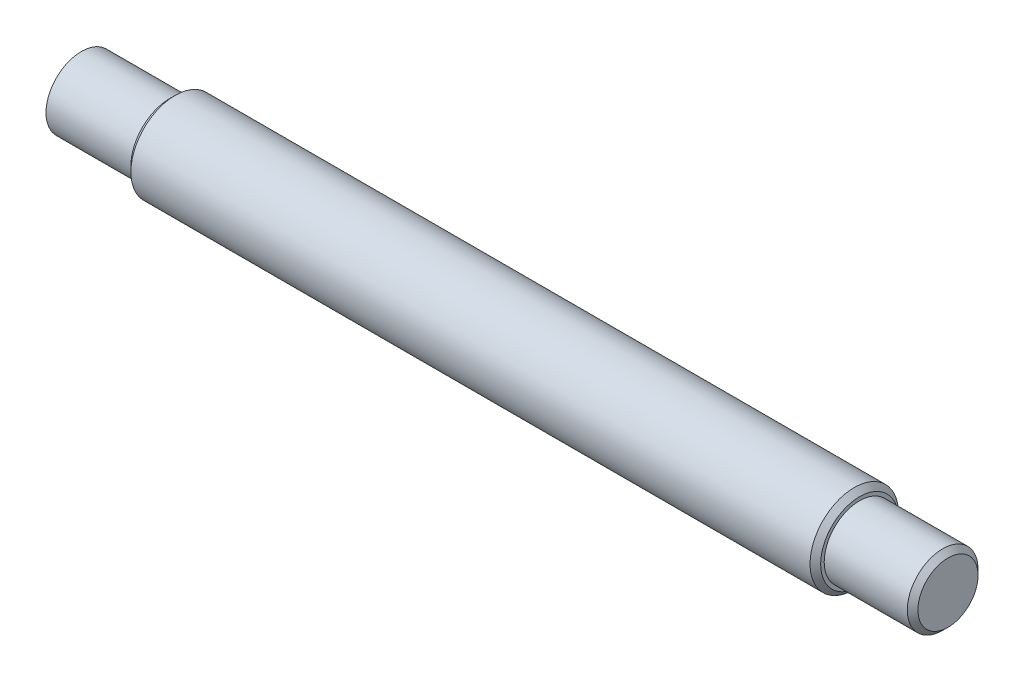
ISO-10303-21;
HEADER;
FILE_DESCRIPTION(('STEP AP214'),'2;1');
FILE_NAME('part.step','',(''),(''),'','','');
FILE_SCHEMA(('AUTOMOTIVE_DESIGN { 1 0 10303 214 1 1 1 1 }'));
ENDSEC;
DATA;
#1=APPLICATION_CONTEXT('core data for automotive mechanical design processes');
#2=APPLICATION_PROTOCOL_DEFINITION('international standard','automotive_design',2000,#1);
#3=PRODUCT_CONTEXT('',#1,'mechanical');
#4=PRODUCT('Part','Part','',(#3));
#5=PRODUCT_RELATED_PRODUCT_CATEGORY('part','',(#4));
#6=PRODUCT_DEFINITION_FORMATION('','',#4);
#7=PRODUCT_DEFINITION_CONTEXT('part definition',#1,'design');
#8=PRODUCT_DEFINITION('design','',#6,#7);
#9=PRODUCT_DEFINITION_SHAPE('','',#8);
#10=(LENGTH_UNIT() NAMED_UNIT(*) SI_UNIT(.MILLI.,.METRE.));
#11=(NAMED_UNIT(*) PLANE_ANGLE_UNIT() SI_UNIT($,.RADIAN.));
#12=(NAMED_UNIT(*) SI_UNIT($,.STERADIAN.) SOLID_ANGLE_UNIT());
#13=UNCERTAINTY_MEASURE_WITH_UNIT(LENGTH_MEASURE(1.E-05),#10,'distance_accuracy_value','');
#14=(GEOMETRIC_REPRESENTATION_CONTEXT(3) GLOBAL_UNCERTAINTY_ASSIGNED_CONTEXT((#13)) GLOBAL_UNIT_ASSIGNED_CONTEXT((#10,
#11,#12)) REPRESENTATION_CONTEXT('',''));
#15=CARTESIAN_POINT('',(0.,0.,0.));
#16=DIRECTION('',(0.,0.,1.));
#17=DIRECTION('',(1.,0.,0.));
#18=AXIS2_PLACEMENT_3D('',#15,#16,#17);
#19=CARTESIAN_POINT('',(36.,0.,0.));
#20=DIRECTION('',(-1.,0.,0.));
#21=DIRECTION('',(0.,0.,1.));
#22=AXIS2_PLACEMENT_3D('',#19,#20,#21);
#23=PLANE('',#22);
#24=CARTESIAN_POINT('',(36.,0.,0.));
#25=DIRECTION('',(-1.,0.,0.));
#26=DIRECTION('',(0.,0.,1.));
#27=AXIS2_PLACEMENT_3D('',#24,#25,#26);
#28=CIRCLE('',#27,1.70000000000001);
#29=CARTESIAN_POINT('',(36.,0.,1.70000000000001));
#30=VERTEX_POINT('',#29);
#31=EDGE_CURVE('E50',#30,#30,#28,.F.);
#32=ORIENTED_EDGE('',*,*,#31,.T.);
#33=EDGE_LOOP('',(#32));
#34=FACE_BOUND('',#33,.T.);
#35=ADVANCED_FACE('F30',(#34),#23,.F.);
#36=CARTESIAN_POINT('',(-77.8939944150163,0.,0.));
#37=DIRECTION('',(-1.,0.,0.));
#38=DIRECTION('',(0.,0.,1.));
#39=AXIS2_PLACEMENT_3D('',#36,#37,#38);
#40=CYLINDRICAL_SURFACE('',#39,2.);
#41=CARTESIAN_POINT('',(35.7,0.,0.));
#42=DIRECTION('',(-1.,0.,0.));
#43=DIRECTION('',(0.,0.,1.));
#44=AXIS2_PLACEMENT_3D('',#41,#42,#43);
#45=CIRCLE('',#44,2.);
#46=CARTESIAN_POINT('',(35.7,0.,2.));
#47=VERTEX_POINT('',#46);
#48=EDGE_CURVE('E53',#47,#47,#45,.T.);
#49=ORIENTED_EDGE('',*,*,#48,.T.);
#50=EDGE_LOOP('',(#49));
#51=FACE_BOUND('',#50,.T.);
#52=CARTESIAN_POINT('',(31.,0.,0.));
#53=DIRECTION('',(-1.,0.,0.));
#54=DIRECTION('',(0.,0.,1.));
#55=AXIS2_PLACEMENT_3D('',#52,#53,#54);
#56=CIRCLE('',#55,2.);
#57=CARTESIAN_POINT('',(31.,0.,2.));
#58=VERTEX_POINT('',#57);
#59=EDGE_CURVE('E56',#58,#58,#56,.T.);
#60=ORIENTED_EDGE('',*,*,#59,.F.);
#61=EDGE_LOOP('',(#60));
#62=FACE_BOUND('',#61,.T.);
#63=ADVANCED_FACE('F103',(#51,#62),#40,.T.);
#64=CARTESIAN_POINT('',(31.,2.5,0.));
#65=DIRECTION('',(-1.,0.,0.));
#66=DIRECTION('',(0.,0.,1.));
#67=AXIS2_PLACEMENT_3D('',#64,#65,#66);
#68=PLANE('',#67);
#69=CARTESIAN_POINT('',(31.,0.,0.));
#70=DIRECTION('',(-1.,0.,0.));
#71=DIRECTION('',(0.,0.,1.));
#72=AXIS2_PLACEMENT_3D('',#69,#70,#71);
#73=CIRCLE('',#72,2.19999999999999);
#74=CARTESIAN_POINT('',(31.,0.,2.19999999999999));
#75=VERTEX_POINT('',#74);
#76=EDGE_CURVE('E10',#75,#75,#73,.F.);
#77=ORIENTED_EDGE('',*,*,#76,.T.);
#78=EDGE_LOOP('',(#77));
#79=FACE_BOUND('',#78,.T.);
#80=ORIENTED_EDGE('',*,*,#59,.T.);
#81=EDGE_LOOP('',(#80));
#82=FACE_BOUND('',#81,.T.);
#83=ADVANCED_FACE('F100',(#79,#82),#68,.F.);
#84=CARTESIAN_POINT('',(-77.8939944150163,0.,0.));
#85=DIRECTION('',(-1.,0.,0.));
#86=DIRECTION('',(0.,0.,1.));
#87=AXIS2_PLACEMENT_3D('',#84,#85,#86);
#88=CYLINDRICAL_SURFACE('',#87,2.5);
#89=CARTESIAN_POINT('',(-7.7,0.,0.));
#90=DIRECTION('',(1.,0.,0.));
#91=DIRECTION('',(0.,0.,-1.));
#92=AXIS2_PLACEMENT_3D('',#89,#90,#91);
#93=CIRCLE('',#92,2.5);
#94=CARTESIAN_POINT('',(-7.7,0.,-2.5));
#95=VERTEX_POINT('',#94);
#96=EDGE_CURVE('E37',#95,#95,#93,.T.);
#97=ORIENTED_EDGE('',*,*,#96,.T.);
#98=EDGE_LOOP('',(#97));
#99=FACE_BOUND('',#98,.T.);
#100=CARTESIAN_POINT('',(30.7,0.,0.));
#101=DIRECTION('',(-1.,0.,0.));
#102=DIRECTION('',(0.,0.,1.));
#103=AXIS2_PLACEMENT_3D('',#100,#101,#102);
#104=CIRCLE('',#103,2.5);
#105=CARTESIAN_POINT('',(30.7,0.,2.5));
#106=VERTEX_POINT('',#105);
#107=EDGE_CURVE('E41',#106,#106,#104,.T.);
#108=ORIENTED_EDGE('',*,*,#107,.T.);
#109=EDGE_LOOP('',(#108));
#110=FACE_BOUND('',#109,.T.);
#111=ADVANCED_FACE('F94',(#99,#110),#88,.T.);
#112=CARTESIAN_POINT('',(-8.,2.5,0.));
#113=DIRECTION('',(1.,0.,0.));
#114=DIRECTION('',(0.,0.,-1.));
#115=AXIS2_PLACEMENT_3D('',#112,#113,#114);
#116=PLANE('',#115);
#117=CARTESIAN_POINT('',(-8.,0.,0.));
#118=DIRECTION('',(1.,0.,0.));
#119=DIRECTION('',(0.,0.,-1.));
#120=AXIS2_PLACEMENT_3D('',#117,#118,#119);
#121=CIRCLE('',#120,2.19999999999998);
#122=CARTESIAN_POINT('',(-8.,0.,-2.19999999999998));
#123=VERTEX_POINT('',#122);
#124=EDGE_CURVE('E45',#123,#123,#121,.F.);
#125=ORIENTED_EDGE('',*,*,#124,.T.);
#126=EDGE_LOOP('',(#125));
#127=FACE_BOUND('',#126,.T.);
#128=CARTESIAN_POINT('',(-7.99999999999999,0.,0.));
#129=DIRECTION('',(-1.,0.,0.));
#130=DIRECTION('',(0.,0.,1.));
#131=AXIS2_PLACEMENT_3D('',#128,#129,#130);
#132=CIRCLE('',#131,2.);
#133=CARTESIAN_POINT('',(-7.99999999999999,0.,2.));
#134=VERTEX_POINT('',#133);
#135=EDGE_CURVE('E59',#134,#134,#132,.T.);
#136=ORIENTED_EDGE('',*,*,#135,.F.);
#137=EDGE_LOOP('',(#136));
#138=FACE_BOUND('',#137,.T.);
#139=ADVANCED_FACE('F89',(#127,#138),#116,.F.);
#140=CARTESIAN_POINT('',(-77.8939944150163,0.,0.));
#141=DIRECTION('',(-1.,0.,0.));
#142=DIRECTION('',(0.,0.,1.));
#143=AXIS2_PLACEMENT_3D('',#140,#141,#142);
#144=CYLINDRICAL_SURFACE('',#143,2.);
#145=CARTESIAN_POINT('',(-13.,0.,0.));
#146=DIRECTION('',(-1.,0.,0.));
#147=DIRECTION('',(0.,0.,1.));
#148=AXIS2_PLACEMENT_3D('',#145,#146,#147);
#149=CIRCLE('',#148,2.);
#150=CARTESIAN_POINT('',(-13.,0.,2.));
#151=VERTEX_POINT('',#150);
#152=EDGE_CURVE('E62',#151,#151,#149,.T.);
#153=ORIENTED_EDGE('',*,*,#152,.F.);
#154=EDGE_LOOP('',(#153));
#155=FACE_BOUND('',#154,.T.);
#156=ORIENTED_EDGE('',*,*,#135,.T.);
#157=EDGE_LOOP('',(#156));
#158=FACE_BOUND('',#157,.T.);
#159=ADVANCED_FACE('F83',(#155,#158),#144,.T.);
#160=CARTESIAN_POINT('',(-13.,2.,0.));
#161=DIRECTION('',(1.,0.,0.));
#162=DIRECTION('',(0.,0.,-1.));
#163=AXIS2_PLACEMENT_3D('',#160,#161,#162);
#164=PLANE('',#163);
#165=CARTESIAN_POINT('',(-13.,0.,0.));
#166=DIRECTION('',(-1.,0.,0.));
#167=DIRECTION('',(0.,0.,1.));
#168=AXIS2_PLACEMENT_3D('',#165,#166,#167);
#169=CIRCLE('',#168,1.2);
#170=CARTESIAN_POINT('',(-13.,0.,1.2));
#171=VERTEX_POINT('',#170);
#172=EDGE_CURVE('E65',#171,#171,#169,.T.);
#173=ORIENTED_EDGE('',*,*,#172,.F.);
#174=EDGE_LOOP('',(#173));
#175=FACE_BOUND('',#174,.T.);
#176=ORIENTED_EDGE('',*,*,#152,.T.);
#177=EDGE_LOOP('',(#176));
#178=FACE_BOUND('',#177,.T.);
#179=ADVANCED_FACE('F77',(#175,#178),#164,.F.);
#180=CARTESIAN_POINT('',(-77.8939944150163,0.,0.));
#181=DIRECTION('',(-1.,0.,0.));
#182=DIRECTION('',(0.,0.,1.));
#183=AXIS2_PLACEMENT_3D('',#180,#181,#182);
#184=CYLINDRICAL_SURFACE('',#183,1.2);
#185=CARTESIAN_POINT('',(0.,0.,0.));
#186=DIRECTION('',(-1.,0.,0.));
#187=DIRECTION('',(0.,0.,1.));
#188=AXIS2_PLACEMENT_3D('',#185,#186,#187);
#189=CIRCLE('',#188,1.2);
#190=CARTESIAN_POINT('',(0.,0.,1.2));
#191=VERTEX_POINT('',#190);
#192=EDGE_CURVE('E68',#191,#191,#189,.T.);
#193=ORIENTED_EDGE('',*,*,#192,.F.);
#194=EDGE_LOOP('',(#193));
#195=FACE_BOUND('',#194,.T.);
#196=ORIENTED_EDGE('',*,*,#172,.T.);
#197=EDGE_LOOP('',(#196));
#198=FACE_BOUND('',#197,.T.);
#199=ADVANCED_FACE('F74',(#195,#198),#184,.F.);
#200=CARTESIAN_POINT('',(0.,1.2,0.));
#201=DIRECTION('',(1.,0.,0.));
#202=DIRECTION('',(0.,0.,-1.));
#203=AXIS2_PLACEMENT_3D('',#200,#201,#202);
#204=PLANE('',#203);
#205=ORIENTED_EDGE('',*,*,#192,.T.);
#206=EDGE_LOOP('',(#205));
#207=FACE_BOUND('',#206,.T.);
#208=ADVANCED_FACE('F72',(#207),#204,.F.);
#209=CARTESIAN_POINT('',(35.7,0.,0.));
#210=DIRECTION('',(-1.,0.,0.));
#211=DIRECTION('',(0.,0.,1.));
#212=AXIS2_PLACEMENT_3D('',#209,#210,#211);
#213=CONICAL_SURFACE('',#212,2.,0.78539816339743);
#214=ORIENTED_EDGE('',*,*,#31,.F.);
#215=EDGE_LOOP('',(#214));
#216=FACE_BOUND('',#215,.T.);
#217=ORIENTED_EDGE('',*,*,#48,.F.);
#218=EDGE_LOOP('',(#217));
#219=FACE_BOUND('',#218,.T.);
#220=ADVANCED_FACE('F113',(#216,#219),#213,.T.);
#221=CARTESIAN_POINT('',(-7.99999999999999,0.,0.));
#222=DIRECTION('',(1.,0.,0.));
#223=DIRECTION('',(0.,0.,-1.));
#224=AXIS2_PLACEMENT_3D('',#221,#222,#223);
#225=CONICAL_SURFACE('',#224,2.19999999999999,0.785398163397476);
#226=ORIENTED_EDGE('',*,*,#96,.F.);
#227=EDGE_LOOP('',(#226));
#228=FACE_BOUND('',#227,.T.);
#229=ORIENTED_EDGE('',*,*,#124,.F.);
#230=EDGE_LOOP('',(#229));
#231=FACE_BOUND('',#230,.T.);
#232=ADVANCED_FACE('F115',(#228,#231),#225,.T.);
#233=CARTESIAN_POINT('',(30.7,0.,0.));
#234=DIRECTION('',(-1.,0.,0.));
#235=DIRECTION('',(0.,0.,1.));
#236=AXIS2_PLACEMENT_3D('',#233,#234,#235);
#237=CONICAL_SURFACE('',#236,2.5,0.785398163397453);
#238=ORIENTED_EDGE('',*,*,#76,.F.);
#239=EDGE_LOOP('',(#238));
#240=FACE_BOUND('',#239,.T.);
#241=ORIENTED_EDGE('',*,*,#107,.F.);
#242=EDGE_LOOP('',(#241));
#243=FACE_BOUND('',#242,.T.);
#244=ADVANCED_FACE('F32',(#240,#243),#237,.T.);
#245=CLOSED_SHELL('',(#35,#63,#83,#111,#139,#159,#179,#199,#208,#220,#232,#244));
#246=MANIFOLD_SOLID_BREP('B2',#245);
#247=ADVANCED_BREP_SHAPE_REPRESENTATION('',(#18,#246),#14);
#248=SHAPE_DEFINITION_REPRESENTATION(#9,#247);
ENDSEC;
END-ISO-10303-21;
